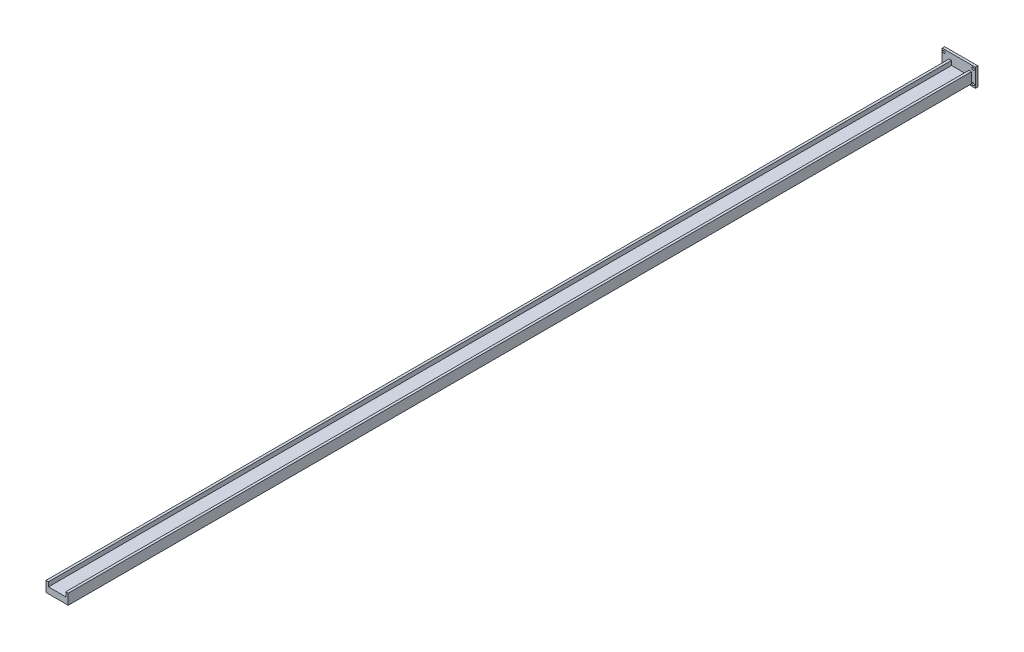
ISO-10303-21;
HEADER;
FILE_DESCRIPTION(('STEP AP214'),'2;1');
FILE_NAME('part.step','',(''),(''),'','','');
FILE_SCHEMA(('AUTOMOTIVE_DESIGN { 1 0 10303 214 1 1 1 1 }'));
ENDSEC;
DATA;
#1=APPLICATION_CONTEXT('core data for automotive mechanical design processes');
#2=APPLICATION_PROTOCOL_DEFINITION('international standard','automotive_design',2000,#1);
#3=PRODUCT_CONTEXT('',#1,'mechanical');
#4=PRODUCT('Part','Part','',(#3));
#5=PRODUCT_RELATED_PRODUCT_CATEGORY('part','',(#4));
#6=PRODUCT_DEFINITION_FORMATION('','',#4);
#7=PRODUCT_DEFINITION_CONTEXT('part definition',#1,'design');
#8=PRODUCT_DEFINITION('design','',#6,#7);
#9=PRODUCT_DEFINITION_SHAPE('','',#8);
#10=(LENGTH_UNIT() NAMED_UNIT(*) SI_UNIT(.MILLI.,.METRE.));
#11=(NAMED_UNIT(*) PLANE_ANGLE_UNIT() SI_UNIT($,.RADIAN.));
#12=(NAMED_UNIT(*) SI_UNIT($,.STERADIAN.) SOLID_ANGLE_UNIT());
#13=UNCERTAINTY_MEASURE_WITH_UNIT(LENGTH_MEASURE(1.E-05),#10,'distance_accuracy_value','');
#14=(GEOMETRIC_REPRESENTATION_CONTEXT(3) GLOBAL_UNCERTAINTY_ASSIGNED_CONTEXT((#13)) GLOBAL_UNIT_ASSIGNED_CONTEXT((#10,
#11,#12)) REPRESENTATION_CONTEXT('',''));
#15=CARTESIAN_POINT('',(0.,0.,0.));
#16=DIRECTION('',(0.,0.,1.));
#17=DIRECTION('',(1.,0.,0.));
#18=AXIS2_PLACEMENT_3D('',#15,#16,#17);
#19=CARTESIAN_POINT('',(19.0125075447709,6.60074566578948,1828.));
#20=DIRECTION('',(1.,0.,0.));
#21=DIRECTION('',(0.,1.,0.));
#22=AXIS2_PLACEMENT_3D('',#19,#20,#21);
#23=PLANE('',#22);
#24=DIRECTION('',(0.,-1.,0.));
#25=VECTOR('',#24,1.);
#26=CARTESIAN_POINT('',(19.0125075447709,6.60074566578948,0.));
#27=LINE('',#26,#25);
#28=CARTESIAN_POINT('',(19.0125075447709,6.60074566578948,0.));
#29=VERTEX_POINT('',#28);
#30=CARTESIAN_POINT('',(19.0125075447709,-2.35882007920822,0.));
#31=VERTEX_POINT('',#30);
#32=EDGE_CURVE('E161',#29,#31,#27,.T.);
#33=ORIENTED_EDGE('',*,*,#32,.T.);
#34=DIRECTION('',(0.,0.,-1.));
#35=VECTOR('',#34,1.);
#36=CARTESIAN_POINT('',(19.0125075447709,-2.35882007920822,1828.));
#37=LINE('',#36,#35);
#38=CARTESIAN_POINT('',(19.0125075447709,-2.35882007920822,1828.));
#39=VERTEX_POINT('',#38);
#40=EDGE_CURVE('E11',#39,#31,#37,.T.);
#41=ORIENTED_EDGE('',*,*,#40,.F.);
#42=DIRECTION('',(0.,-1.,0.));
#43=VECTOR('',#42,1.);
#44=CARTESIAN_POINT('',(19.0125075447709,6.60074566578948,1828.));
#45=LINE('',#44,#43);
#46=CARTESIAN_POINT('',(19.0125075447709,6.60074566578948,1828.));
#47=VERTEX_POINT('',#46);
#48=EDGE_CURVE('E172',#47,#39,#45,.T.);
#49=ORIENTED_EDGE('',*,*,#48,.F.);
#50=DIRECTION('',(0.,0.,-1.));
#51=VECTOR('',#50,1.);
#52=CARTESIAN_POINT('',(19.0125075447709,6.60074566578948,1828.));
#53=LINE('',#52,#51);
#54=EDGE_CURVE('E195',#47,#29,#53,.T.);
#55=ORIENTED_EDGE('',*,*,#54,.T.);
#56=EDGE_LOOP('',(#33,#41,#49,#55));
#57=FACE_BOUND('',#56,.T.);
#58=ADVANCED_FACE('F47',(#57),#23,.F.);
#59=CARTESIAN_POINT('',(-15.9874924552291,-2.35882007920822,1828.));
#60=DIRECTION('',(0.,-1.,0.));
#61=DIRECTION('',(0.,0.,-1.));
#62=AXIS2_PLACEMENT_3D('',#59,#60,#61);
#63=PLANE('',#62);
#64=DIRECTION('',(-1.,0.,0.));
#65=VECTOR('',#64,1.);
#66=CARTESIAN_POINT('',(-15.9874924552291,-2.35882007920822,0.));
#67=LINE('',#66,#65);
#68=CARTESIAN_POINT('',(-15.9874924552291,-2.35882007920822,0.));
#69=VERTEX_POINT('',#68);
#70=EDGE_CURVE('E166',#31,#69,#67,.T.);
#71=ORIENTED_EDGE('',*,*,#70,.T.);
#72=DIRECTION('',(0.,0.,-1.));
#73=VECTOR('',#72,1.);
#74=CARTESIAN_POINT('',(-15.9874924552291,-2.35882007920822,1828.));
#75=LINE('',#74,#73);
#76=CARTESIAN_POINT('',(-15.9874924552291,-2.35882007920822,1828.));
#77=VERTEX_POINT('',#76);
#78=EDGE_CURVE('E56',#77,#69,#75,.T.);
#79=ORIENTED_EDGE('',*,*,#78,.F.);
#80=DIRECTION('',(-1.,0.,0.));
#81=VECTOR('',#80,1.);
#82=CARTESIAN_POINT('',(-15.9874924552291,-2.35882007920822,1828.));
#83=LINE('',#82,#81);
#84=EDGE_CURVE('E175',#39,#77,#83,.T.);
#85=ORIENTED_EDGE('',*,*,#84,.F.);
#86=ORIENTED_EDGE('',*,*,#40,.T.);
#87=EDGE_LOOP('',(#71,#79,#85,#86));
#88=FACE_BOUND('',#87,.T.);
#89=ADVANCED_FACE('F254',(#88),#63,.F.);
#90=CARTESIAN_POINT('',(-15.9874924552291,6.60074566578948,1828.));
#91=DIRECTION('',(-1.,0.,0.));
#92=DIRECTION('',(0.,0.,1.));
#93=AXIS2_PLACEMENT_3D('',#90,#91,#92);
#94=PLANE('',#93);
#95=DIRECTION('',(0.,1.,0.));
#96=VECTOR('',#95,1.);
#97=CARTESIAN_POINT('',(-15.9874924552291,6.60074566578948,0.));
#98=LINE('',#97,#96);
#99=CARTESIAN_POINT('',(-15.9874924552291,6.60074566578948,0.));
#100=VERTEX_POINT('',#99);
#101=EDGE_CURVE('E200',#69,#100,#98,.T.);
#102=ORIENTED_EDGE('',*,*,#101,.T.);
#103=DIRECTION('',(0.,0.,-1.));
#104=VECTOR('',#103,1.);
#105=CARTESIAN_POINT('',(-15.9874924552291,6.60074566578948,1828.));
#106=LINE('',#105,#104);
#107=CARTESIAN_POINT('',(-15.9874924552291,6.60074566578948,1828.));
#108=VERTEX_POINT('',#107);
#109=EDGE_CURVE('E242',#108,#100,#106,.T.);
#110=ORIENTED_EDGE('',*,*,#109,.F.);
#111=DIRECTION('',(0.,1.,0.));
#112=VECTOR('',#111,1.);
#113=CARTESIAN_POINT('',(-15.9874924552291,6.60074566578948,1828.));
#114=LINE('',#113,#112);
#115=EDGE_CURVE('E179',#77,#108,#114,.T.);
#116=ORIENTED_EDGE('',*,*,#115,.F.);
#117=ORIENTED_EDGE('',*,*,#78,.T.);
#118=EDGE_LOOP('',(#102,#110,#116,#117));
#119=FACE_BOUND('',#118,.T.);
#120=ADVANCED_FACE('F250',(#119),#94,.F.);
#121=CARTESIAN_POINT('',(-20.9874924552291,6.60074566578948,1828.));
#122=DIRECTION('',(0.,-1.,0.));
#123=DIRECTION('',(0.,0.,-1.));
#124=AXIS2_PLACEMENT_3D('',#121,#122,#123);
#125=PLANE('',#124);
#126=DIRECTION('',(-1.,0.,0.));
#127=VECTOR('',#126,1.);
#128=CARTESIAN_POINT('',(-20.9874924552291,6.60074566578948,0.));
#129=LINE('',#128,#127);
#130=CARTESIAN_POINT('',(-20.9874924552291,6.60074566578948,0.));
#131=VERTEX_POINT('',#130);
#132=EDGE_CURVE('E204',#100,#131,#129,.T.);
#133=ORIENTED_EDGE('',*,*,#132,.T.);
#134=DIRECTION('',(0.,0.,-1.));
#135=VECTOR('',#134,1.);
#136=CARTESIAN_POINT('',(-20.9874924552291,6.60074566578948,1828.));
#137=LINE('',#136,#135);
#138=CARTESIAN_POINT('',(-20.9874924552291,6.60074566578948,1828.));
#139=VERTEX_POINT('',#138);
#140=EDGE_CURVE('E238',#139,#131,#137,.T.);
#141=ORIENTED_EDGE('',*,*,#140,.F.);
#142=DIRECTION('',(-1.,0.,0.));
#143=VECTOR('',#142,1.);
#144=CARTESIAN_POINT('',(-20.9874924552291,6.60074566578948,1828.));
#145=LINE('',#144,#143);
#146=EDGE_CURVE('E182',#108,#139,#145,.T.);
#147=ORIENTED_EDGE('',*,*,#146,.F.);
#148=ORIENTED_EDGE('',*,*,#109,.T.);
#149=EDGE_LOOP('',(#133,#141,#147,#148));
#150=FACE_BOUND('',#149,.T.);
#151=ADVANCED_FACE('F261',(#150),#125,.F.);
#152=CARTESIAN_POINT('',(-20.9874924552291,6.60074566578948,1828.));
#153=DIRECTION('',(1.,0.,0.));
#154=DIRECTION('',(0.,0.,-1.));
#155=AXIS2_PLACEMENT_3D('',#152,#153,#154);
#156=PLANE('',#155);
#157=DIRECTION('',(0.,-1.,0.));
#158=VECTOR('',#157,1.);
#159=CARTESIAN_POINT('',(-20.9874924552291,6.60074566578948,0.));
#160=LINE('',#159,#158);
#161=CARTESIAN_POINT('',(-20.9874924552291,-14.7268325339884,0.));
#162=VERTEX_POINT('',#161);
#163=EDGE_CURVE('E208',#131,#162,#160,.T.);
#164=ORIENTED_EDGE('',*,*,#163,.T.);
#165=DIRECTION('',(0.,0.,-1.));
#166=VECTOR('',#165,1.);
#167=CARTESIAN_POINT('',(-20.9874924552291,-14.7268325339884,1828.));
#168=LINE('',#167,#166);
#169=CARTESIAN_POINT('',(-20.9874924552291,-14.7268325339884,1828.));
#170=VERTEX_POINT('',#169);
#171=EDGE_CURVE('E234',#170,#162,#168,.T.);
#172=ORIENTED_EDGE('',*,*,#171,.F.);
#173=DIRECTION('',(0.,-1.,0.));
#174=VECTOR('',#173,1.);
#175=CARTESIAN_POINT('',(-20.9874924552291,6.60074566578948,1828.));
#176=LINE('',#175,#174);
#177=EDGE_CURVE('E185',#139,#170,#176,.T.);
#178=ORIENTED_EDGE('',*,*,#177,.F.);
#179=ORIENTED_EDGE('',*,*,#140,.T.);
#180=EDGE_LOOP('',(#164,#172,#178,#179));
#181=FACE_BOUND('',#180,.T.);
#182=ADVANCED_FACE('F265',(#181),#156,.F.);
#183=CARTESIAN_POINT('',(-20.9874924552291,-14.7268325339884,1828.));
#184=DIRECTION('',(0.,1.,0.));
#185=DIRECTION('',(0.,0.,1.));
#186=AXIS2_PLACEMENT_3D('',#183,#184,#185);
#187=PLANE('',#186);
#188=DIRECTION('',(1.,0.,0.));
#189=VECTOR('',#188,1.);
#190=CARTESIAN_POINT('',(-20.9874924552291,-14.7268325339884,0.));
#191=LINE('',#190,#189);
#192=CARTESIAN_POINT('',(24.0125075447708,-14.7268325339884,0.));
#193=VERTEX_POINT('',#192);
#194=EDGE_CURVE('E212',#162,#193,#191,.T.);
#195=ORIENTED_EDGE('',*,*,#194,.T.);
#196=DIRECTION('',(0.,0.,-1.));
#197=VECTOR('',#196,1.);
#198=CARTESIAN_POINT('',(24.0125075447708,-14.7268325339884,1828.));
#199=LINE('',#198,#197);
#200=CARTESIAN_POINT('',(24.0125075447708,-14.7268325339884,1828.));
#201=VERTEX_POINT('',#200);
#202=EDGE_CURVE('E230',#201,#193,#199,.T.);
#203=ORIENTED_EDGE('',*,*,#202,.F.);
#204=DIRECTION('',(1.,0.,0.));
#205=VECTOR('',#204,1.);
#206=CARTESIAN_POINT('',(-20.9874924552291,-14.7268325339884,1828.));
#207=LINE('',#206,#205);
#208=EDGE_CURVE('E188',#170,#201,#207,.T.);
#209=ORIENTED_EDGE('',*,*,#208,.F.);
#210=ORIENTED_EDGE('',*,*,#171,.T.);
#211=EDGE_LOOP('',(#195,#203,#209,#210));
#212=FACE_BOUND('',#211,.T.);
#213=ADVANCED_FACE('F279',(#212),#187,.F.);
#214=CARTESIAN_POINT('',(24.0125075447708,6.60074566578948,1828.));
#215=DIRECTION('',(-1.,0.,0.));
#216=DIRECTION('',(0.,0.,1.));
#217=AXIS2_PLACEMENT_3D('',#214,#215,#216);
#218=PLANE('',#217);
#219=DIRECTION('',(0.,1.,0.));
#220=VECTOR('',#219,1.);
#221=CARTESIAN_POINT('',(24.0125075447708,6.60074566578948,0.));
#222=LINE('',#221,#220);
#223=CARTESIAN_POINT('',(24.0125075447708,6.60074566578948,0.));
#224=VERTEX_POINT('',#223);
#225=EDGE_CURVE('E216',#193,#224,#222,.T.);
#226=ORIENTED_EDGE('',*,*,#225,.T.);
#227=DIRECTION('',(0.,0.,-1.));
#228=VECTOR('',#227,1.);
#229=CARTESIAN_POINT('',(24.0125075447708,6.60074566578948,1828.));
#230=LINE('',#229,#228);
#231=CARTESIAN_POINT('',(24.0125075447708,6.60074566578948,1828.));
#232=VERTEX_POINT('',#231);
#233=EDGE_CURVE('E226',#232,#224,#230,.T.);
#234=ORIENTED_EDGE('',*,*,#233,.F.);
#235=DIRECTION('',(0.,1.,0.));
#236=VECTOR('',#235,1.);
#237=CARTESIAN_POINT('',(24.0125075447708,6.60074566578948,1828.));
#238=LINE('',#237,#236);
#239=EDGE_CURVE('E191',#201,#232,#238,.T.);
#240=ORIENTED_EDGE('',*,*,#239,.F.);
#241=ORIENTED_EDGE('',*,*,#202,.T.);
#242=EDGE_LOOP('',(#226,#234,#240,#241));
#243=FACE_BOUND('',#242,.T.);
#244=ADVANCED_FACE('F276',(#243),#218,.F.);
#245=CARTESIAN_POINT('',(19.0125075447709,6.60074566578948,1828.));
#246=DIRECTION('',(0.,-1.,0.));
#247=DIRECTION('',(0.,0.,-1.));
#248=AXIS2_PLACEMENT_3D('',#245,#246,#247);
#249=PLANE('',#248);
#250=DIRECTION('',(-1.,0.,0.));
#251=VECTOR('',#250,1.);
#252=CARTESIAN_POINT('',(19.0125075447709,6.60074566578948,0.));
#253=LINE('',#252,#251);
#254=EDGE_CURVE('E176',#224,#29,#253,.T.);
#255=ORIENTED_EDGE('',*,*,#254,.T.);
#256=ORIENTED_EDGE('',*,*,#54,.F.);
#257=DIRECTION('',(-1.,0.,0.));
#258=VECTOR('',#257,1.);
#259=CARTESIAN_POINT('',(19.0125075447709,6.60074566578948,1828.));
#260=LINE('',#259,#258);
#261=EDGE_CURVE('E63',#232,#47,#260,.T.);
#262=ORIENTED_EDGE('',*,*,#261,.F.);
#263=ORIENTED_EDGE('',*,*,#233,.T.);
#264=EDGE_LOOP('',(#255,#256,#262,#263));
#265=FACE_BOUND('',#264,.T.);
#266=ADVANCED_FACE('F273',(#265),#249,.F.);
#267=CARTESIAN_POINT('',(0.,0.,1828.));
#268=DIRECTION('',(0.,0.,1.));
#269=DIRECTION('',(1.,0.,0.));
#270=AXIS2_PLACEMENT_3D('',#267,#268,#269);
#271=PLANE('',#270);
#272=ORIENTED_EDGE('',*,*,#48,.T.);
#273=ORIENTED_EDGE('',*,*,#84,.T.);
#274=ORIENTED_EDGE('',*,*,#115,.T.);
#275=ORIENTED_EDGE('',*,*,#146,.T.);
#276=ORIENTED_EDGE('',*,*,#177,.T.);
#277=ORIENTED_EDGE('',*,*,#208,.T.);
#278=ORIENTED_EDGE('',*,*,#239,.T.);
#279=ORIENTED_EDGE('',*,*,#261,.T.);
#280=EDGE_LOOP('',(#272,#273,#274,#275,#276,#277,#278,#279));
#281=FACE_BOUND('',#280,.T.);
#282=ADVANCED_FACE('F268',(#281),#271,.T.);
#283=CARTESIAN_POINT('',(0.,0.,-5.));
#284=DIRECTION('',(0.,0.,-1.));
#285=DIRECTION('',(-1.,0.,0.));
#286=AXIS2_PLACEMENT_3D('',#283,#284,#285);
#287=PLANE('',#286);
#288=CARTESIAN_POINT('',(-31.4144218284499,-13.2160853560071,-5.));
#289=DIRECTION('',(0.,0.,-1.));
#290=DIRECTION('',(-1.,0.,0.));
#291=AXIS2_PLACEMENT_3D('',#288,#289,#290);
#292=CIRCLE('',#291,2.5);
#293=CARTESIAN_POINT('',(-33.9144218284499,-13.2160853560071,-5.));
#294=VERTEX_POINT('',#293);
#295=EDGE_CURVE('E446',#294,#294,#292,.T.);
#296=ORIENTED_EDGE('',*,*,#295,.F.);
#297=EDGE_LOOP('',(#296));
#298=FACE_BOUND('',#297,.T.);
#299=CARTESIAN_POINT('',(27.5972400961184,13.7245301372536,-5.));
#300=DIRECTION('',(0.,0.,-1.));
#301=DIRECTION('',(-1.,0.,0.));
#302=AXIS2_PLACEMENT_3D('',#299,#300,#301);
#303=CIRCLE('',#302,2.5);
#304=CARTESIAN_POINT('',(25.0972400961184,13.7245301372536,-5.));
#305=VERTEX_POINT('',#304);
#306=EDGE_CURVE('E462',#305,#305,#303,.T.);
#307=ORIENTED_EDGE('',*,*,#306,.F.);
#308=EDGE_LOOP('',(#307));
#309=FACE_BOUND('',#308,.T.);
#310=DIRECTION('',(0.,1.,0.));
#311=VECTOR('',#310,1.);
#312=CARTESIAN_POINT('',(-34.7955141906705,18.7245301372536,-5.));
#313=LINE('',#312,#311);
#314=CARTESIAN_POINT('',(-34.7955141906705,-18.2160853560071,-5.));
#315=VERTEX_POINT('',#314);
#316=CARTESIAN_POINT('',(-34.7955141906705,18.7245301372536,-5.));
#317=VERTEX_POINT('',#316);
#318=EDGE_CURVE('E144',#315,#317,#313,.T.);
#319=ORIENTED_EDGE('',*,*,#318,.T.);
#320=DIRECTION('',(1.,0.,0.));
#321=VECTOR('',#320,1.);
#322=CARTESIAN_POINT('',(32.5972400961184,18.7245301372536,-5.));
#323=LINE('',#322,#321);
#324=CARTESIAN_POINT('',(32.5972400961184,18.7245301372536,-5.));
#325=VERTEX_POINT('',#324);
#326=EDGE_CURVE('E132',#317,#325,#323,.T.);
#327=ORIENTED_EDGE('',*,*,#326,.T.);
#328=DIRECTION('',(0.,-1.,0.));
#329=VECTOR('',#328,1.);
#330=CARTESIAN_POINT('',(32.5972400961184,18.7245301372536,-5.));
#331=LINE('',#330,#329);
#332=CARTESIAN_POINT('',(32.5972400961184,-18.2160853560071,-5.));
#333=VERTEX_POINT('',#332);
#334=EDGE_CURVE('E143',#325,#333,#331,.T.);
#335=ORIENTED_EDGE('',*,*,#334,.T.);
#336=DIRECTION('',(-1.,0.,0.));
#337=VECTOR('',#336,1.);
#338=CARTESIAN_POINT('',(32.5972400961184,-18.2160853560071,-5.));
#339=LINE('',#338,#337);
#340=EDGE_CURVE('E150',#333,#315,#339,.T.);
#341=ORIENTED_EDGE('',*,*,#340,.T.);
#342=EDGE_LOOP('',(#319,#327,#335,#341));
#343=FACE_BOUND('',#342,.T.);
#344=CARTESIAN_POINT('',(-31.5653037852792,13.7245301372536,-5.));
#345=DIRECTION('',(0.,0.,-1.));
#346=DIRECTION('',(-1.,0.,0.));
#347=AXIS2_PLACEMENT_3D('',#344,#345,#346);
#348=CIRCLE('',#347,2.49999999999999);
#349=CARTESIAN_POINT('',(-34.0653037852792,13.7245301372536,-5.));
#350=VERTEX_POINT('',#349);
#351=EDGE_CURVE('E454',#350,#350,#348,.T.);
#352=ORIENTED_EDGE('',*,*,#351,.F.);
#353=EDGE_LOOP('',(#352));
#354=FACE_BOUND('',#353,.T.);
#355=CARTESIAN_POINT('',(27.7481220529477,-13.2160853560071,-5.));
#356=DIRECTION('',(0.,0.,-1.));
#357=DIRECTION('',(-1.,0.,0.));
#358=AXIS2_PLACEMENT_3D('',#355,#356,#357);
#359=CIRCLE('',#358,2.5);
#360=CARTESIAN_POINT('',(25.2481220529477,-13.2160853560071,-5.));
#361=VERTEX_POINT('',#360);
#362=EDGE_CURVE('E435',#361,#361,#359,.T.);
#363=ORIENTED_EDGE('',*,*,#362,.F.);
#364=EDGE_LOOP('',(#363));
#365=FACE_BOUND('',#364,.T.);
#366=ADVANCED_FACE('F147',(#298,#309,#343,#354,#365),#287,.T.);
#367=CARTESIAN_POINT('',(0.,0.,0.));
#368=DIRECTION('',(0.,0.,-1.));
#369=DIRECTION('',(-1.,0.,0.));
#370=AXIS2_PLACEMENT_3D('',#367,#368,#369);
#371=PLANE('',#370);
#372=ORIENTED_EDGE('',*,*,#32,.F.);
#373=ORIENTED_EDGE('',*,*,#254,.F.);
#374=ORIENTED_EDGE('',*,*,#225,.F.);
#375=ORIENTED_EDGE('',*,*,#194,.F.);
#376=ORIENTED_EDGE('',*,*,#163,.F.);
#377=ORIENTED_EDGE('',*,*,#132,.F.);
#378=ORIENTED_EDGE('',*,*,#101,.F.);
#379=ORIENTED_EDGE('',*,*,#70,.F.);
#380=EDGE_LOOP('',(#372,#373,#374,#375,#376,#377,#378,#379));
#381=FACE_BOUND('',#380,.T.);
#382=DIRECTION('',(0.,1.,0.));
#383=VECTOR('',#382,1.);
#384=CARTESIAN_POINT('',(-34.7955141906705,18.7245301372536,0.));
#385=LINE('',#384,#383);
#386=CARTESIAN_POINT('',(-34.7955141906705,-18.2160853560071,0.));
#387=VERTEX_POINT('',#386);
#388=CARTESIAN_POINT('',(-34.7955141906705,18.7245301372536,0.));
#389=VERTEX_POINT('',#388);
#390=EDGE_CURVE('E159',#387,#389,#385,.T.);
#391=ORIENTED_EDGE('',*,*,#390,.F.);
#392=DIRECTION('',(-1.,0.,0.));
#393=VECTOR('',#392,1.);
#394=CARTESIAN_POINT('',(32.5972400961184,-18.2160853560071,0.));
#395=LINE('',#394,#393);
#396=CARTESIAN_POINT('',(32.5972400961184,-18.2160853560071,0.));
#397=VERTEX_POINT('',#396);
#398=EDGE_CURVE('E155',#397,#387,#395,.T.);
#399=ORIENTED_EDGE('',*,*,#398,.F.);
#400=DIRECTION('',(0.,-1.,0.));
#401=VECTOR('',#400,1.);
#402=CARTESIAN_POINT('',(32.5972400961184,18.7245301372536,0.));
#403=LINE('',#402,#401);
#404=CARTESIAN_POINT('',(32.5972400961184,18.7245301372536,0.));
#405=VERTEX_POINT('',#404);
#406=EDGE_CURVE('E479',#405,#397,#403,.T.);
#407=ORIENTED_EDGE('',*,*,#406,.F.);
#408=DIRECTION('',(1.,0.,0.));
#409=VECTOR('',#408,1.);
#410=CARTESIAN_POINT('',(32.5972400961184,18.7245301372536,0.));
#411=LINE('',#410,#409);
#412=EDGE_CURVE('E476',#389,#405,#411,.T.);
#413=ORIENTED_EDGE('',*,*,#412,.F.);
#414=EDGE_LOOP('',(#391,#399,#407,#413));
#415=FACE_BOUND('',#414,.T.);
#416=CARTESIAN_POINT('',(27.5972400961184,13.7245301372536,0.));
#417=DIRECTION('',(0.,0.,-1.));
#418=DIRECTION('',(-1.,0.,0.));
#419=AXIS2_PLACEMENT_3D('',#416,#417,#418);
#420=CIRCLE('',#419,2.5);
#421=CARTESIAN_POINT('',(25.0972400961184,13.7245301372536,0.));
#422=VERTEX_POINT('',#421);
#423=EDGE_CURVE('E458',#422,#422,#420,.T.);
#424=ORIENTED_EDGE('',*,*,#423,.T.);
#425=EDGE_LOOP('',(#424));
#426=FACE_BOUND('',#425,.T.);
#427=CARTESIAN_POINT('',(-31.5653037852792,13.7245301372536,0.));
#428=DIRECTION('',(0.,0.,-1.));
#429=DIRECTION('',(-1.,0.,0.));
#430=AXIS2_PLACEMENT_3D('',#427,#428,#429);
#431=CIRCLE('',#430,2.49999999999999);
#432=CARTESIAN_POINT('',(-34.0653037852792,13.7245301372536,0.));
#433=VERTEX_POINT('',#432);
#434=EDGE_CURVE('E450',#433,#433,#431,.T.);
#435=ORIENTED_EDGE('',*,*,#434,.T.);
#436=EDGE_LOOP('',(#435));
#437=FACE_BOUND('',#436,.T.);
#438=CARTESIAN_POINT('',(-31.4144218284499,-13.2160853560071,0.));
#439=DIRECTION('',(0.,0.,-1.));
#440=DIRECTION('',(-1.,0.,0.));
#441=AXIS2_PLACEMENT_3D('',#438,#439,#440);
#442=CIRCLE('',#441,2.5);
#443=CARTESIAN_POINT('',(-33.9144218284499,-13.2160853560071,0.));
#444=VERTEX_POINT('',#443);
#445=EDGE_CURVE('E443',#444,#444,#442,.T.);
#446=ORIENTED_EDGE('',*,*,#445,.T.);
#447=EDGE_LOOP('',(#446));
#448=FACE_BOUND('',#447,.T.);
#449=CARTESIAN_POINT('',(27.7481220529477,-13.2160853560071,0.));
#450=DIRECTION('',(0.,0.,-1.));
#451=DIRECTION('',(-1.,0.,0.));
#452=AXIS2_PLACEMENT_3D('',#449,#450,#451);
#453=CIRCLE('',#452,2.5);
#454=CARTESIAN_POINT('',(25.2481220529477,-13.2160853560071,0.));
#455=VERTEX_POINT('',#454);
#456=EDGE_CURVE('E438',#455,#455,#453,.T.);
#457=ORIENTED_EDGE('',*,*,#456,.T.);
#458=EDGE_LOOP('',(#457));
#459=FACE_BOUND('',#458,.T.);
#460=ADVANCED_FACE('F257',(#381,#415,#426,#437,#448,#459),#371,.F.);
#461=CARTESIAN_POINT('',(-34.7955141906705,18.7245301372536,-5.));
#462=DIRECTION('',(1.,0.,0.));
#463=DIRECTION('',(0.,0.,-1.));
#464=AXIS2_PLACEMENT_3D('',#461,#462,#463);
#465=PLANE('',#464);
#466=ORIENTED_EDGE('',*,*,#390,.T.);
#467=DIRECTION('',(0.,0.,1.));
#468=VECTOR('',#467,1.);
#469=CARTESIAN_POINT('',(-34.7955141906705,18.7245301372536,-5.));
#470=LINE('',#469,#468);
#471=EDGE_CURVE('E136',#317,#389,#470,.T.);
#472=ORIENTED_EDGE('',*,*,#471,.F.);
#473=ORIENTED_EDGE('',*,*,#318,.F.);
#474=DIRECTION('',(0.,0.,1.));
#475=VECTOR('',#474,1.);
#476=CARTESIAN_POINT('',(-34.7955141906705,-18.2160853560071,-5.));
#477=LINE('',#476,#475);
#478=EDGE_CURVE('E473',#315,#387,#477,.T.);
#479=ORIENTED_EDGE('',*,*,#478,.T.);
#480=EDGE_LOOP('',(#466,#472,#473,#479));
#481=FACE_BOUND('',#480,.T.);
#482=ADVANCED_FACE('F157',(#481),#465,.F.);
#483=CARTESIAN_POINT('',(32.5972400961184,18.7245301372536,-5.));
#484=DIRECTION('',(0.,-1.,0.));
#485=DIRECTION('',(0.,0.,-1.));
#486=AXIS2_PLACEMENT_3D('',#483,#484,#485);
#487=PLANE('',#486);
#488=ORIENTED_EDGE('',*,*,#412,.T.);
#489=DIRECTION('',(0.,0.,1.));
#490=VECTOR('',#489,1.);
#491=CARTESIAN_POINT('',(32.5972400961184,18.7245301372536,-5.));
#492=LINE('',#491,#490);
#493=EDGE_CURVE('E139',#325,#405,#492,.T.);
#494=ORIENTED_EDGE('',*,*,#493,.F.);
#495=ORIENTED_EDGE('',*,*,#326,.F.);
#496=ORIENTED_EDGE('',*,*,#471,.T.);
#497=EDGE_LOOP('',(#488,#494,#495,#496));
#498=FACE_BOUND('',#497,.T.);
#499=ADVANCED_FACE('F134',(#498),#487,.F.);
#500=CARTESIAN_POINT('',(32.5972400961184,18.7245301372536,-5.));
#501=DIRECTION('',(-1.,0.,0.));
#502=DIRECTION('',(0.,0.,1.));
#503=AXIS2_PLACEMENT_3D('',#500,#501,#502);
#504=PLANE('',#503);
#505=ORIENTED_EDGE('',*,*,#406,.T.);
#506=DIRECTION('',(0.,0.,1.));
#507=VECTOR('',#506,1.);
#508=CARTESIAN_POINT('',(32.5972400961184,-18.2160853560071,-5.));
#509=LINE('',#508,#507);
#510=EDGE_CURVE('E168',#333,#397,#509,.T.);
#511=ORIENTED_EDGE('',*,*,#510,.F.);
#512=ORIENTED_EDGE('',*,*,#334,.F.);
#513=ORIENTED_EDGE('',*,*,#493,.T.);
#514=EDGE_LOOP('',(#505,#511,#512,#513));
#515=FACE_BOUND('',#514,.T.);
#516=ADVANCED_FACE('F370',(#515),#504,.F.);
#517=CARTESIAN_POINT('',(32.5972400961184,-18.2160853560071,-5.));
#518=DIRECTION('',(0.,1.,0.));
#519=DIRECTION('',(0.,0.,1.));
#520=AXIS2_PLACEMENT_3D('',#517,#518,#519);
#521=PLANE('',#520);
#522=ORIENTED_EDGE('',*,*,#398,.T.);
#523=ORIENTED_EDGE('',*,*,#478,.F.);
#524=ORIENTED_EDGE('',*,*,#340,.F.);
#525=ORIENTED_EDGE('',*,*,#510,.T.);
#526=EDGE_LOOP('',(#522,#523,#524,#525));
#527=FACE_BOUND('',#526,.T.);
#528=ADVANCED_FACE('F379',(#527),#521,.F.);
#529=CARTESIAN_POINT('',(27.5972400961184,13.7245301372536,-5.));
#530=DIRECTION('',(0.,0.,1.));
#531=DIRECTION('',(1.,0.,0.));
#532=AXIS2_PLACEMENT_3D('',#529,#530,#531);
#533=CYLINDRICAL_SURFACE('',#532,2.5);
#534=ORIENTED_EDGE('',*,*,#306,.T.);
#535=EDGE_LOOP('',(#534));
#536=FACE_BOUND('',#535,.T.);
#537=ORIENTED_EDGE('',*,*,#423,.F.);
#538=EDGE_LOOP('',(#537));
#539=FACE_BOUND('',#538,.T.);
#540=ADVANCED_FACE('F389',(#536,#539),#533,.F.);
#541=CARTESIAN_POINT('',(-31.5653037852792,13.7245301372536,-5.));
#542=DIRECTION('',(0.,0.,1.));
#543=DIRECTION('',(1.,0.,0.));
#544=AXIS2_PLACEMENT_3D('',#541,#542,#543);
#545=CYLINDRICAL_SURFACE('',#544,2.49999999999999);
#546=ORIENTED_EDGE('',*,*,#351,.T.);
#547=EDGE_LOOP('',(#546));
#548=FACE_BOUND('',#547,.T.);
#549=ORIENTED_EDGE('',*,*,#434,.F.);
#550=EDGE_LOOP('',(#549));
#551=FACE_BOUND('',#550,.T.);
#552=ADVANCED_FACE('F399',(#548,#551),#545,.F.);
#553=CARTESIAN_POINT('',(-31.4144218284499,-13.2160853560071,-5.));
#554=DIRECTION('',(0.,0.,1.));
#555=DIRECTION('',(1.,0.,0.));
#556=AXIS2_PLACEMENT_3D('',#553,#554,#555);
#557=CYLINDRICAL_SURFACE('',#556,2.5);
#558=ORIENTED_EDGE('',*,*,#295,.T.);
#559=EDGE_LOOP('',(#558));
#560=FACE_BOUND('',#559,.T.);
#561=ORIENTED_EDGE('',*,*,#445,.F.);
#562=EDGE_LOOP('',(#561));
#563=FACE_BOUND('',#562,.T.);
#564=ADVANCED_FACE('F409',(#560,#563),#557,.F.);
#565=CARTESIAN_POINT('',(27.7481220529477,-13.2160853560071,-5.));
#566=DIRECTION('',(0.,0.,1.));
#567=DIRECTION('',(1.,0.,0.));
#568=AXIS2_PLACEMENT_3D('',#565,#566,#567);
#569=CYLINDRICAL_SURFACE('',#568,2.5);
#570=ORIENTED_EDGE('',*,*,#362,.T.);
#571=EDGE_LOOP('',(#570));
#572=FACE_BOUND('',#571,.T.);
#573=ORIENTED_EDGE('',*,*,#456,.F.);
#574=EDGE_LOOP('',(#573));
#575=FACE_BOUND('',#574,.T.);
#576=ADVANCED_FACE('F419',(#572,#575),#569,.F.);
#577=CLOSED_SHELL('',(#58,#89,#120,#151,#182,#213,#244,#266,#282,#366,#460,#482,#499,#516,#528,
#540,#552,#564,#576));
#578=MANIFOLD_SOLID_BREP('B2',#577);
#579=ADVANCED_BREP_SHAPE_REPRESENTATION('',(#18,#578),#14);
#580=SHAPE_DEFINITION_REPRESENTATION(#9,#579);
ENDSEC;
END-ISO-10303-21;
